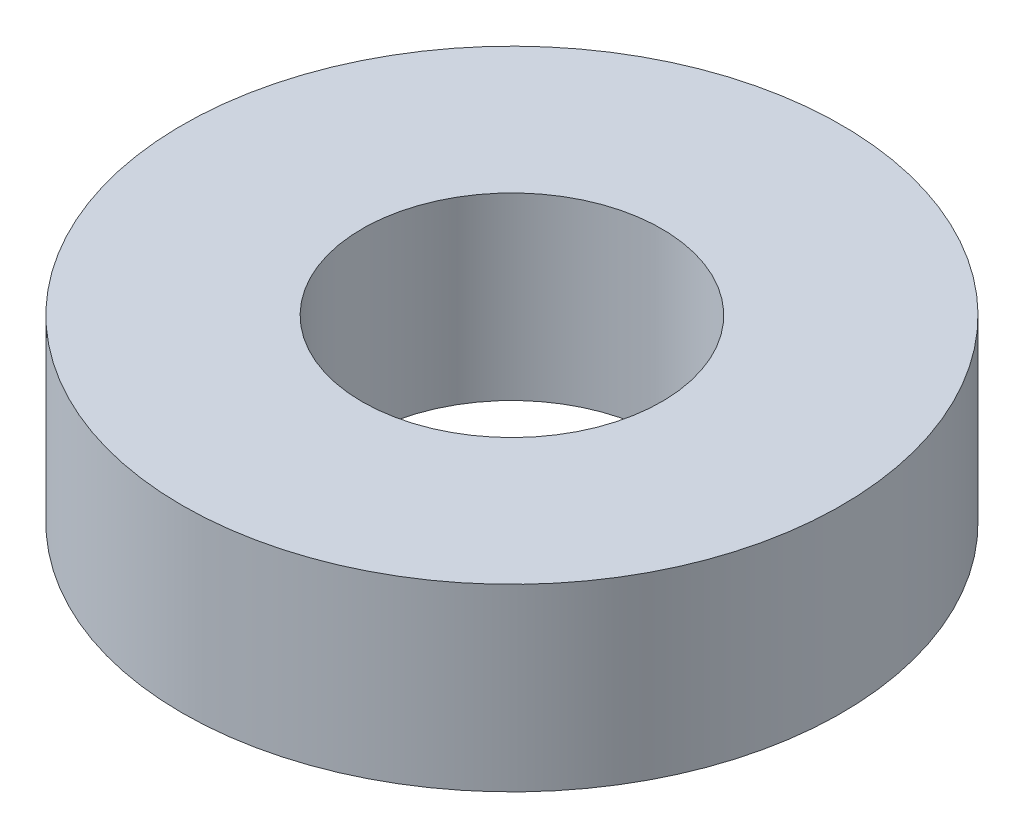
ISO-10303-21;
HEADER;
FILE_DESCRIPTION(('STEP AP214'),'2;1');
FILE_NAME('part.step','',(''),(''),'','','');
FILE_SCHEMA(('AUTOMOTIVE_DESIGN { 1 0 10303 214 1 1 1 1 }'));
ENDSEC;
DATA;
#1=APPLICATION_CONTEXT('core data for automotive mechanical design processes');
#2=APPLICATION_PROTOCOL_DEFINITION('international standard','automotive_design',2000,#1);
#3=PRODUCT_CONTEXT('',#1,'mechanical');
#4=PRODUCT('Part','Part','',(#3));
#5=PRODUCT_RELATED_PRODUCT_CATEGORY('part','',(#4));
#6=PRODUCT_DEFINITION_FORMATION('','',#4);
#7=PRODUCT_DEFINITION_CONTEXT('part definition',#1,'design');
#8=PRODUCT_DEFINITION('design','',#6,#7);
#9=PRODUCT_DEFINITION_SHAPE('','',#8);
#10=(LENGTH_UNIT() NAMED_UNIT(*) SI_UNIT(.MILLI.,.METRE.));
#11=(NAMED_UNIT(*) PLANE_ANGLE_UNIT() SI_UNIT($,.RADIAN.));
#12=(NAMED_UNIT(*) SI_UNIT($,.STERADIAN.) SOLID_ANGLE_UNIT());
#13=UNCERTAINTY_MEASURE_WITH_UNIT(LENGTH_MEASURE(1.E-05),#10,'distance_accuracy_value','');
#14=(GEOMETRIC_REPRESENTATION_CONTEXT(3) GLOBAL_UNCERTAINTY_ASSIGNED_CONTEXT((#13)) GLOBAL_UNIT_ASSIGNED_CONTEXT((#10,
#11,#12)) REPRESENTATION_CONTEXT('',''));
#15=CARTESIAN_POINT('',(0.,0.,0.));
#16=DIRECTION('',(0.,0.,1.));
#17=DIRECTION('',(1.,0.,0.));
#18=AXIS2_PLACEMENT_3D('',#15,#16,#17);
#19=CARTESIAN_POINT('',(0.,3.,0.));
#20=DIRECTION('',(0.,1.,0.));
#21=DIRECTION('',(0.,0.,1.));
#22=AXIS2_PLACEMENT_3D('',#19,#20,#21);
#23=PLANE('',#22);
#24=CARTESIAN_POINT('',(0.,3.,0.));
#25=DIRECTION('',(0.,1.,0.));
#26=DIRECTION('',(0.,0.,1.));
#27=AXIS2_PLACEMENT_3D('',#24,#25,#26);
#28=CIRCLE('',#27,5.5);
#29=CARTESIAN_POINT('',(0.,3.,5.5));
#30=VERTEX_POINT('',#29);
#31=EDGE_CURVE('E10',#30,#30,#28,.T.);
#32=ORIENTED_EDGE('',*,*,#31,.T.);
#33=EDGE_LOOP('',(#32));
#34=FACE_BOUND('',#33,.T.);
#35=CARTESIAN_POINT('',(0.,3.,0.));
#36=DIRECTION('',(0.,1.,0.));
#37=DIRECTION('',(0.,0.,1.));
#38=AXIS2_PLACEMENT_3D('',#35,#36,#37);
#39=CIRCLE('',#38,2.5);
#40=CARTESIAN_POINT('',(0.,3.,2.5));
#41=VERTEX_POINT('',#40);
#42=EDGE_CURVE('E50',#41,#41,#39,.T.);
#43=ORIENTED_EDGE('',*,*,#42,.F.);
#44=EDGE_LOOP('',(#43));
#45=FACE_BOUND('',#44,.T.);
#46=ADVANCED_FACE('F37',(#34,#45),#23,.T.);
#47=CARTESIAN_POINT('',(0.,0.,0.));
#48=DIRECTION('',(0.,1.,0.));
#49=DIRECTION('',(0.,0.,1.));
#50=AXIS2_PLACEMENT_3D('',#47,#48,#49);
#51=PLANE('',#50);
#52=CARTESIAN_POINT('',(0.,0.,0.));
#53=DIRECTION('',(0.,1.,0.));
#54=DIRECTION('',(0.,0.,1.));
#55=AXIS2_PLACEMENT_3D('',#52,#53,#54);
#56=CIRCLE('',#55,5.5);
#57=CARTESIAN_POINT('',(0.,0.,5.5));
#58=VERTEX_POINT('',#57);
#59=EDGE_CURVE('E41',#58,#58,#56,.T.);
#60=ORIENTED_EDGE('',*,*,#59,.F.);
#61=EDGE_LOOP('',(#60));
#62=FACE_BOUND('',#61,.T.);
#63=CARTESIAN_POINT('',(0.,0.,0.));
#64=DIRECTION('',(0.,1.,0.));
#65=DIRECTION('',(0.,0.,1.));
#66=AXIS2_PLACEMENT_3D('',#63,#64,#65);
#67=CIRCLE('',#66,2.5);
#68=CARTESIAN_POINT('',(0.,0.,2.5));
#69=VERTEX_POINT('',#68);
#70=EDGE_CURVE('E52',#69,#69,#67,.T.);
#71=ORIENTED_EDGE('',*,*,#70,.T.);
#72=EDGE_LOOP('',(#71));
#73=FACE_BOUND('',#72,.T.);
#74=ADVANCED_FACE('F64',(#62,#73),#51,.F.);
#75=CARTESIAN_POINT('',(0.,3.,0.));
#76=DIRECTION('',(0.,-1.,0.));
#77=DIRECTION('',(0.,0.,-1.));
#78=AXIS2_PLACEMENT_3D('',#75,#76,#77);
#79=CYLINDRICAL_SURFACE('',#78,5.5);
#80=ORIENTED_EDGE('',*,*,#31,.F.);
#81=EDGE_LOOP('',(#80));
#82=FACE_BOUND('',#81,.T.);
#83=ORIENTED_EDGE('',*,*,#59,.T.);
#84=EDGE_LOOP('',(#83));
#85=FACE_BOUND('',#84,.T.);
#86=ADVANCED_FACE('F39',(#82,#85),#79,.T.);
#87=CARTESIAN_POINT('',(0.,3.,0.));
#88=DIRECTION('',(0.,-1.,0.));
#89=DIRECTION('',(0.,0.,-1.));
#90=AXIS2_PLACEMENT_3D('',#87,#88,#89);
#91=CYLINDRICAL_SURFACE('',#90,2.5);
#92=ORIENTED_EDGE('',*,*,#42,.T.);
#93=EDGE_LOOP('',(#92));
#94=FACE_BOUND('',#93,.T.);
#95=ORIENTED_EDGE('',*,*,#70,.F.);
#96=EDGE_LOOP('',(#95));
#97=FACE_BOUND('',#96,.T.);
#98=ADVANCED_FACE('F60',(#94,#97),#91,.F.);
#99=CLOSED_SHELL('',(#46,#74,#86,#98));
#100=MANIFOLD_SOLID_BREP('B2',#99);
#101=ADVANCED_BREP_SHAPE_REPRESENTATION('',(#18,#100),#14);
#102=SHAPE_DEFINITION_REPRESENTATION(#9,#101);
ENDSEC;
END-ISO-10303-21;
